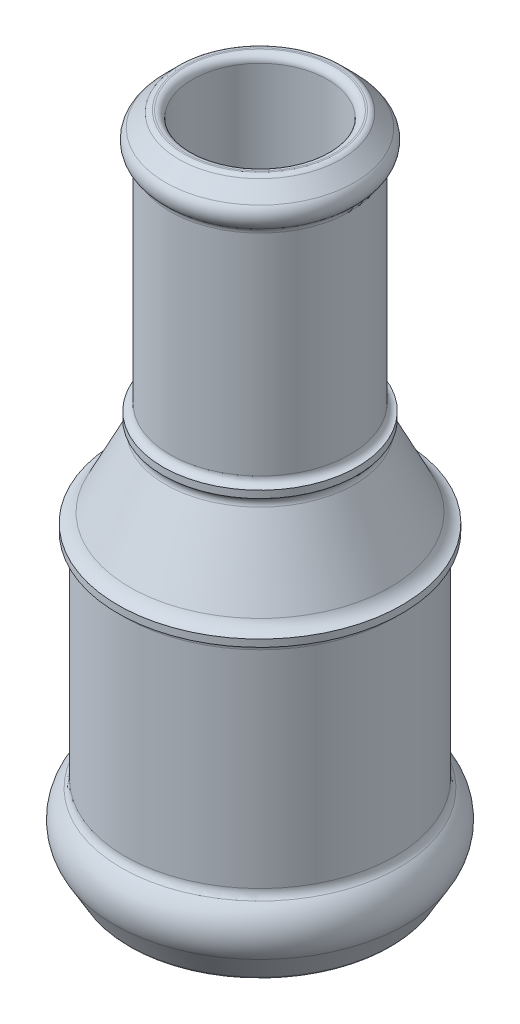
ISO-10303-21;
HEADER;
FILE_DESCRIPTION(('STEP AP214'),'2;1');
FILE_NAME('part.step','',(''),(''),'','','');
FILE_SCHEMA(('AUTOMOTIVE_DESIGN { 1 0 10303 214 1 1 1 1 }'));
ENDSEC;
DATA;
#1=APPLICATION_CONTEXT('core data for automotive mechanical design processes');
#2=APPLICATION_PROTOCOL_DEFINITION('international standard','automotive_design',2000,#1);
#3=PRODUCT_CONTEXT('',#1,'mechanical');
#4=PRODUCT('Part','Part','',(#3));
#5=PRODUCT_RELATED_PRODUCT_CATEGORY('part','',(#4));
#6=PRODUCT_DEFINITION_FORMATION('','',#4);
#7=PRODUCT_DEFINITION_CONTEXT('part definition',#1,'design');
#8=PRODUCT_DEFINITION('design','',#6,#7);
#9=PRODUCT_DEFINITION_SHAPE('','',#8);
#10=(LENGTH_UNIT() NAMED_UNIT(*) SI_UNIT(.MILLI.,.METRE.));
#11=(NAMED_UNIT(*) PLANE_ANGLE_UNIT() SI_UNIT($,.RADIAN.));
#12=(NAMED_UNIT(*) SI_UNIT($,.STERADIAN.) SOLID_ANGLE_UNIT());
#13=UNCERTAINTY_MEASURE_WITH_UNIT(LENGTH_MEASURE(1.E-05),#10,'distance_accuracy_value','');
#14=(GEOMETRIC_REPRESENTATION_CONTEXT(3) GLOBAL_UNCERTAINTY_ASSIGNED_CONTEXT((#13)) GLOBAL_UNIT_ASSIGNED_CONTEXT((#10,
#11,#12)) REPRESENTATION_CONTEXT('',''));
#15=CARTESIAN_POINT('',(0.,0.,0.));
#16=DIRECTION('',(0.,0.,1.));
#17=DIRECTION('',(1.,0.,0.));
#18=AXIS2_PLACEMENT_3D('',#15,#16,#17);
#19=CARTESIAN_POINT('',(0.,0.,0.));
#20=DIRECTION('',(0.,-1.,0.));
#21=DIRECTION('',(0.,0.,-1.));
#22=AXIS2_PLACEMENT_3D('',#19,#20,#21);
#23=CYLINDRICAL_SURFACE('',#22,6.858);
#24=CARTESIAN_POINT('',(0.,28.321,0.));
#25=DIRECTION('',(0.,-1.,0.));
#26=DIRECTION('',(0.,0.,-1.));
#27=AXIS2_PLACEMENT_3D('',#24,#25,#26);
#28=CIRCLE('',#27,6.858);
#29=CARTESIAN_POINT('',(0.,28.321,-6.858));
#30=VERTEX_POINT('',#29);
#31=EDGE_CURVE('E118',#30,#30,#28,.T.);
#32=ORIENTED_EDGE('',*,*,#31,.T.);
#33=EDGE_LOOP('',(#32));
#34=FACE_BOUND('',#33,.T.);
#35=CARTESIAN_POINT('',(0.,27.813,0.));
#36=DIRECTION('',(0.,-1.,0.));
#37=DIRECTION('',(0.,0.,-1.));
#38=AXIS2_PLACEMENT_3D('',#35,#36,#37);
#39=CIRCLE('',#38,6.858);
#40=CARTESIAN_POINT('',(0.,27.813,-6.858));
#41=VERTEX_POINT('',#40);
#42=EDGE_CURVE('E121',#41,#41,#39,.T.);
#43=ORIENTED_EDGE('',*,*,#42,.F.);
#44=EDGE_LOOP('',(#43));
#45=FACE_BOUND('',#44,.T.);
#46=ADVANCED_FACE('F44',(#34,#45),#23,.T.);
#47=CARTESIAN_POINT('',(0.,21.463,0.));
#48=DIRECTION('',(0.,-1.,0.));
#49=DIRECTION('',(0.,0.,-1.));
#50=AXIS2_PLACEMENT_3D('',#47,#48,#49);
#51=CONICAL_SURFACE('',#50,9.525,0.463647609000806);
#52=CARTESIAN_POINT('',(0.,22.130499072282,0.));
#53=DIRECTION('',(0.,-1.,0.));
#54=DIRECTION('',(0.,0.,-1.));
#55=AXIS2_PLACEMENT_3D('',#52,#53,#54);
#56=CIRCLE('',#55,9.19125046385899);
#57=CARTESIAN_POINT('',(0.,22.130499072282,-9.19125046385899));
#58=VERTEX_POINT('',#57);
#59=EDGE_CURVE('E76',#58,#58,#56,.F.);
#60=ORIENTED_EDGE('',*,*,#59,.T.);
#61=EDGE_LOOP('',(#60));
#62=FACE_BOUND('',#61,.T.);
#63=CARTESIAN_POINT('',(0.,27.1579701937796,0.));
#64=DIRECTION('',(0.,-1.,0.));
#65=DIRECTION('',(0.,0.,-1.));
#66=AXIS2_PLACEMENT_3D('',#63,#64,#65);
#67=CIRCLE('',#66,6.67751490311019);
#68=CARTESIAN_POINT('',(0.,27.1579701937796,-6.67751490311019));
#69=VERTEX_POINT('',#68);
#70=EDGE_CURVE('E85',#69,#69,#67,.T.);
#71=ORIENTED_EDGE('',*,*,#70,.T.);
#72=EDGE_LOOP('',(#71));
#73=FACE_BOUND('',#72,.T.);
#74=ADVANCED_FACE('F138',(#62,#73),#51,.T.);
#75=CARTESIAN_POINT('',(0.,0.,0.));
#76=DIRECTION('',(0.,-1.,0.));
#77=DIRECTION('',(0.,0.,-1.));
#78=AXIS2_PLACEMENT_3D('',#75,#76,#77);
#79=CYLINDRICAL_SURFACE('',#78,10.033);
#80=CARTESIAN_POINT('',(0.,20.955,0.));
#81=DIRECTION('',(0.,-1.,0.));
#82=DIRECTION('',(0.,0.,-1.));
#83=AXIS2_PLACEMENT_3D('',#80,#81,#82);
#84=CIRCLE('',#83,10.033);
#85=CARTESIAN_POINT('',(0.,20.955,-10.033));
#86=VERTEX_POINT('',#85);
#87=EDGE_CURVE('E127',#86,#86,#84,.T.);
#88=ORIENTED_EDGE('',*,*,#87,.F.);
#89=EDGE_LOOP('',(#88));
#90=FACE_BOUND('',#89,.T.);
#91=CARTESIAN_POINT('',(0.,21.463,0.));
#92=DIRECTION('',(0.,-1.,0.));
#93=DIRECTION('',(0.,0.,-1.));
#94=AXIS2_PLACEMENT_3D('',#91,#92,#93);
#95=CIRCLE('',#94,10.033);
#96=CARTESIAN_POINT('',(0.,21.463,-10.033));
#97=VERTEX_POINT('',#96);
#98=EDGE_CURVE('E124',#97,#97,#95,.T.);
#99=ORIENTED_EDGE('',*,*,#98,.T.);
#100=EDGE_LOOP('',(#99));
#101=FACE_BOUND('',#100,.T.);
#102=ADVANCED_FACE('F134',(#90,#101),#79,.T.);
#103=CARTESIAN_POINT('',(0.,0.,0.));
#104=DIRECTION('',(0.,-1.,0.));
#105=DIRECTION('',(0.,0.,-1.));
#106=AXIS2_PLACEMENT_3D('',#103,#104,#105);
#107=CYLINDRICAL_SURFACE('',#106,9.525);
#108=CARTESIAN_POINT('',(0.,20.447,0.));
#109=DIRECTION('',(0.,1.,0.));
#110=DIRECTION('',(0.,0.,1.));
#111=AXIS2_PLACEMENT_3D('',#108,#109,#110);
#112=CIRCLE('',#111,9.525);
#113=CARTESIAN_POINT('',(0.,20.447,9.525));
#114=VERTEX_POINT('',#113);
#115=EDGE_CURVE('E79',#114,#114,#112,.F.);
#116=ORIENTED_EDGE('',*,*,#115,.T.);
#117=EDGE_LOOP('',(#116));
#118=FACE_BOUND('',#117,.T.);
#119=CARTESIAN_POINT('',(0.,5.842,0.));
#120=DIRECTION('',(0.,-1.,0.));
#121=DIRECTION('',(0.,0.,-1.));
#122=AXIS2_PLACEMENT_3D('',#119,#120,#121);
#123=CIRCLE('',#122,9.525);
#124=CARTESIAN_POINT('',(0.,5.842,-9.525));
#125=VERTEX_POINT('',#124);
#126=EDGE_CURVE('E103',#125,#125,#123,.F.);
#127=ORIENTED_EDGE('',*,*,#126,.T.);
#128=EDGE_LOOP('',(#127));
#129=FACE_BOUND('',#128,.T.);
#130=ADVANCED_FACE('F137',(#118,#129),#107,.T.);
#131=CARTESIAN_POINT('',(0.,0.,0.));
#132=DIRECTION('',(0.,1.,0.));
#133=DIRECTION('',(0.,0.,1.));
#134=AXIS2_PLACEMENT_3D('',#131,#132,#133);
#135=PLANE('',#134);
#136=CARTESIAN_POINT('',(0.,0.,0.));
#137=DIRECTION('',(0.,1.,0.));
#138=DIRECTION('',(0.,0.,1.));
#139=AXIS2_PLACEMENT_3D('',#136,#137,#138);
#140=CIRCLE('',#139,8.83876669576836);
#141=CARTESIAN_POINT('',(0.,0.,8.83876669576836));
#142=VERTEX_POINT('',#141);
#143=EDGE_CURVE('E70',#142,#142,#140,.F.);
#144=ORIENTED_EDGE('',*,*,#143,.T.);
#145=EDGE_LOOP('',(#144));
#146=FACE_BOUND('',#145,.T.);
#147=CARTESIAN_POINT('',(0.,0.,0.));
#148=DIRECTION('',(0.,1.,0.));
#149=DIRECTION('',(0.,0.,1.));
#150=AXIS2_PLACEMENT_3D('',#147,#148,#149);
#151=CIRCLE('',#150,8.4455);
#152=CARTESIAN_POINT('',(0.,0.,8.4455));
#153=VERTEX_POINT('',#152);
#154=EDGE_CURVE('E73',#153,#153,#151,.T.);
#155=ORIENTED_EDGE('',*,*,#154,.T.);
#156=EDGE_LOOP('',(#155));
#157=FACE_BOUND('',#156,.T.);
#158=ADVANCED_FACE('F239',(#146,#157),#135,.F.);
#159=CARTESIAN_POINT('',(0.,0.,0.));
#160=DIRECTION('',(0.,-1.,0.));
#161=DIRECTION('',(0.,0.,-1.));
#162=AXIS2_PLACEMENT_3D('',#159,#160,#161);
#163=CYLINDRICAL_SURFACE('',#162,7.9375);
#164=CARTESIAN_POINT('',(0.,0.507999999999999,0.));
#165=DIRECTION('',(0.,1.,0.));
#166=DIRECTION('',(0.,0.,1.));
#167=AXIS2_PLACEMENT_3D('',#164,#165,#166);
#168=CIRCLE('',#167,7.9375);
#169=CARTESIAN_POINT('',(0.,0.507999999999999,7.9375));
#170=VERTEX_POINT('',#169);
#171=EDGE_CURVE('E64',#170,#170,#168,.F.);
#172=ORIENTED_EDGE('',*,*,#171,.T.);
#173=EDGE_LOOP('',(#172));
#174=FACE_BOUND('',#173,.T.);
#175=CARTESIAN_POINT('',(0.,20.2637746743011,0.));
#176=DIRECTION('',(0.,-1.,0.));
#177=DIRECTION('',(0.,0.,-1.));
#178=AXIS2_PLACEMENT_3D('',#175,#176,#177);
#179=CIRCLE('',#178,7.9375);
#180=CARTESIAN_POINT('',(0.,20.2637746743011,-7.9375));
#181=VERTEX_POINT('',#180);
#182=EDGE_CURVE('E109',#181,#181,#179,.F.);
#183=ORIENTED_EDGE('',*,*,#182,.T.);
#184=EDGE_LOOP('',(#183));
#185=FACE_BOUND('',#184,.T.);
#186=ADVANCED_FACE('F235',(#174,#185),#163,.F.);
#187=CARTESIAN_POINT('',(0.,21.463,0.));
#188=DIRECTION('',(0.,-1.,0.));
#189=DIRECTION('',(0.,0.,-1.));
#190=AXIS2_PLACEMENT_3D('',#187,#188,#189);
#191=CONICAL_SURFACE('',#190,7.9375,0.463647609000806);
#192=CARTESIAN_POINT('',(0.,22.5356197394408,0.));
#193=DIRECTION('',(0.,-1.,0.));
#194=DIRECTION('',(0.,0.,-1.));
#195=AXIS2_PLACEMENT_3D('',#192,#193,#194);
#196=CIRCLE('',#195,7.40119013027957);
#197=CARTESIAN_POINT('',(0.,22.5356197394408,-7.40119013027957));
#198=VERTEX_POINT('',#197);
#199=EDGE_CURVE('E112',#198,#198,#196,.T.);
#200=ORIENTED_EDGE('',*,*,#199,.T.);
#201=EDGE_LOOP('',(#200));
#202=FACE_BOUND('',#201,.T.);
#203=CARTESIAN_POINT('',(0.,26.7403802605591,0.));
#204=DIRECTION('',(0.,1.,0.));
#205=DIRECTION('',(0.,0.,1.));
#206=AXIS2_PLACEMENT_3D('',#203,#204,#205);
#207=CIRCLE('',#206,5.29880986972043);
#208=CARTESIAN_POINT('',(0.,26.7403802605591,5.29880986972043));
#209=VERTEX_POINT('',#208);
#210=EDGE_CURVE('E115',#209,#209,#207,.T.);
#211=ORIENTED_EDGE('',*,*,#210,.T.);
#212=EDGE_LOOP('',(#211));
#213=FACE_BOUND('',#212,.T.);
#214=ADVANCED_FACE('F232',(#202,#213),#191,.F.);
#215=CARTESIAN_POINT('',(0.,0.,0.));
#216=DIRECTION('',(0.,-1.,0.));
#217=DIRECTION('',(0.,0.,-1.));
#218=AXIS2_PLACEMENT_3D('',#215,#216,#217);
#219=CYLINDRICAL_SURFACE('',#218,4.7625);
#220=CARTESIAN_POINT('',(0.,46.228,0.));
#221=DIRECTION('',(0.,1.,0.));
#222=DIRECTION('',(0.,0.,1.));
#223=AXIS2_PLACEMENT_3D('',#220,#221,#222);
#224=CIRCLE('',#223,4.7625);
#225=CARTESIAN_POINT('',(0.,46.228,4.7625));
#226=VERTEX_POINT('',#225);
#227=EDGE_CURVE('E10',#226,#226,#224,.T.);
#228=ORIENTED_EDGE('',*,*,#227,.T.);
#229=EDGE_LOOP('',(#228));
#230=FACE_BOUND('',#229,.T.);
#231=CARTESIAN_POINT('',(0.,29.0122253256989,0.));
#232=DIRECTION('',(0.,1.,0.));
#233=DIRECTION('',(0.,0.,1.));
#234=AXIS2_PLACEMENT_3D('',#231,#232,#233);
#235=CIRCLE('',#234,4.7625);
#236=CARTESIAN_POINT('',(0.,29.0122253256989,4.7625));
#237=VERTEX_POINT('',#236);
#238=EDGE_CURVE('E106',#237,#237,#235,.F.);
#239=ORIENTED_EDGE('',*,*,#238,.T.);
#240=EDGE_LOOP('',(#239));
#241=FACE_BOUND('',#240,.T.);
#242=ADVANCED_FACE('F226',(#230,#241),#219,.F.);
#243=CARTESIAN_POINT('',(0.,46.736,0.));
#244=DIRECTION('',(0.,1.,0.));
#245=DIRECTION('',(0.,0.,1.));
#246=AXIS2_PLACEMENT_3D('',#243,#244,#245);
#247=PLANE('',#246);
#248=CARTESIAN_POINT('',(0.,46.736,0.));
#249=DIRECTION('',(0.,1.,0.));
#250=DIRECTION('',(0.,0.,1.));
#251=AXIS2_PLACEMENT_3D('',#248,#249,#250);
#252=CIRCLE('',#251,5.37757951031445);
#253=CARTESIAN_POINT('',(0.,46.736,5.37757951031445));
#254=VERTEX_POINT('',#253);
#255=EDGE_CURVE('E55',#254,#254,#252,.T.);
#256=ORIENTED_EDGE('',*,*,#255,.T.);
#257=EDGE_LOOP('',(#256));
#258=FACE_BOUND('',#257,.T.);
#259=CARTESIAN_POINT('',(0.,46.736,0.));
#260=DIRECTION('',(0.,1.,0.));
#261=DIRECTION('',(0.,0.,1.));
#262=AXIS2_PLACEMENT_3D('',#259,#260,#261);
#263=CIRCLE('',#262,5.2705);
#264=CARTESIAN_POINT('',(0.,46.736,5.2705));
#265=VERTEX_POINT('',#264);
#266=EDGE_CURVE('E59',#265,#265,#263,.F.);
#267=ORIENTED_EDGE('',*,*,#266,.T.);
#268=EDGE_LOOP('',(#267));
#269=FACE_BOUND('',#268,.T.);
#270=ADVANCED_FACE('F219',(#258,#269),#247,.T.);
#271=CARTESIAN_POINT('',(0.,0.,0.));
#272=DIRECTION('',(0.,-1.,0.));
#273=DIRECTION('',(0.,0.,-1.));
#274=AXIS2_PLACEMENT_3D('',#271,#272,#273);
#275=CYLINDRICAL_SURFACE('',#274,6.35);
#276=CARTESIAN_POINT('',(0.,28.829,0.));
#277=DIRECTION('',(0.,1.,0.));
#278=DIRECTION('',(0.,0.,1.));
#279=AXIS2_PLACEMENT_3D('',#276,#277,#278);
#280=CIRCLE('',#279,6.35);
#281=CARTESIAN_POINT('',(0.,28.829,6.35));
#282=VERTEX_POINT('',#281);
#283=EDGE_CURVE('E82',#282,#282,#280,.T.);
#284=ORIENTED_EDGE('',*,*,#283,.T.);
#285=EDGE_LOOP('',(#284));
#286=FACE_BOUND('',#285,.T.);
#287=CARTESIAN_POINT('',(0.,43.688,0.));
#288=DIRECTION('',(0.,-1.,0.));
#289=DIRECTION('',(0.,0.,-1.));
#290=AXIS2_PLACEMENT_3D('',#287,#288,#289);
#291=CIRCLE('',#290,6.35);
#292=CARTESIAN_POINT('',(0.,43.688,-6.35));
#293=VERTEX_POINT('',#292);
#294=EDGE_CURVE('E94',#293,#293,#291,.T.);
#295=ORIENTED_EDGE('',*,*,#294,.T.);
#296=EDGE_LOOP('',(#295));
#297=FACE_BOUND('',#296,.T.);
#298=ADVANCED_FACE('F171',(#286,#297),#275,.T.);
#299=CARTESIAN_POINT('',(0.,20.2637746743011,0.));
#300=DIRECTION('',(0.,-1.,0.));
#301=DIRECTION('',(0.,0.,-1.));
#302=AXIS2_PLACEMENT_3D('',#299,#300,#301);
#303=DEGENERATE_TOROIDAL_SURFACE('',#302,2.8575,5.08,.T.);
#304=ORIENTED_EDGE('',*,*,#182,.F.);
#305=EDGE_LOOP('',(#304));
#306=FACE_BOUND('',#305,.T.);
#307=ORIENTED_EDGE('',*,*,#199,.F.);
#308=EDGE_LOOP('',(#307));
#309=FACE_BOUND('',#308,.T.);
#310=ADVANCED_FACE('F167',(#306,#309),#303,.F.);
#311=CARTESIAN_POINT('',(0.,29.0122253256989,0.));
#312=DIRECTION('',(0.,1.,0.));
#313=DIRECTION('',(0.,0.,1.));
#314=AXIS2_PLACEMENT_3D('',#311,#312,#313);
#315=TOROIDAL_SURFACE('',#314,9.8425,5.08);
#316=ORIENTED_EDGE('',*,*,#210,.F.);
#317=EDGE_LOOP('',(#316));
#318=FACE_BOUND('',#317,.T.);
#319=ORIENTED_EDGE('',*,*,#238,.F.);
#320=EDGE_LOOP('',(#319));
#321=FACE_BOUND('',#320,.T.);
#322=ADVANCED_FACE('F170',(#318,#321),#315,.T.);
#323=CARTESIAN_POINT('',(0.,0.,0.));
#324=DIRECTION('',(0.,1.,0.));
#325=DIRECTION('',(0.,0.,1.));
#326=AXIS2_PLACEMENT_3D('',#323,#324,#325);
#327=CONICAL_SURFACE('',#326,9.13206063251669,0.523598775598296);
#328=CARTESIAN_POINT('',(0.,0.254,0.));
#329=DIRECTION('',(0.,1.,0.));
#330=DIRECTION('',(0.,0.,1.));
#331=AXIS2_PLACEMENT_3D('',#328,#329,#330);
#332=CIRCLE('',#331,9.27870760089085);
#333=CARTESIAN_POINT('',(0.,0.254,9.27870760089085));
#334=VERTEX_POINT('',#333);
#335=EDGE_CURVE('E67',#334,#334,#332,.T.);
#336=CARTESIAN_POINT('',(0.,2.07271748486344,0.));
#337=DIRECTION('',(0.,1.,0.));
#338=DIRECTION('',(0.,0.,1.));
#339=AXIS2_PLACEMENT_3D('',#336,#337,#338);
#340=CIRCLE('',#339,10.3287446303566);
#341=CARTESIAN_POINT('',(0.,2.07271748486344,10.3287446303566));
#342=VERTEX_POINT('',#341);
#343=EDGE_CURVE('E100',#342,#342,#340,.F.);
#344=CARTESIAN_POINT('',(0.,0.254,9.27870760089085));
#345=CARTESIAN_POINT('',(0.,0.272944973800661,9.28964548661445));
#346=CARTESIAN_POINT('',(0.,0.291889947601322,9.30058337233806));
#347=CARTESIAN_POINT('',(0.,0.329779895202643,9.32245914378526));
#348=CARTESIAN_POINT('',(0.,0.348724869003304,9.33339702950886));
#349=CARTESIAN_POINT('',(0.,0.386614816604625,9.35527280095607));
#350=CARTESIAN_POINT('',(0.,0.405559790405286,9.36621068667967));
#351=CARTESIAN_POINT('',(0.,0.443449738006608,9.38808645812687));
#352=CARTESIAN_POINT('',(0.,0.462394711807269,9.39902434385047));
#353=CARTESIAN_POINT('',(0.,0.50028465940859,9.42090011529768));
#354=CARTESIAN_POINT('',(0.,0.519229633209251,9.43183800102128));
#355=CARTESIAN_POINT('',(0.,0.557119580810573,9.45371377246848));
#356=CARTESIAN_POINT('',(0.,0.576064554611234,9.46465165819209));
#357=CARTESIAN_POINT('',(0.,0.613954502212555,9.48652742963929));
#358=CARTESIAN_POINT('',(0.,0.632899476013216,9.49746531536289));
#359=CARTESIAN_POINT('',(0.,0.670789423614537,9.51934108681009));
#360=CARTESIAN_POINT('',(0.,0.689734397415198,9.5302789725337));
#361=CARTESIAN_POINT('',(0.,0.72762434501652,9.5521547439809));
#362=CARTESIAN_POINT('',(0.,0.746569318817181,9.5630926297045));
#363=CARTESIAN_POINT('',(0.,0.784459266418502,9.58496840115171));
#364=CARTESIAN_POINT('',(0.,0.803404240219163,9.59590628687531));
#365=CARTESIAN_POINT('',(0.,0.841294187820485,9.61778205832251));
#366=CARTESIAN_POINT('',(0.,0.860239161621146,9.62871994404611));
#367=CARTESIAN_POINT('',(0.,0.898129109222467,9.65059571549332));
#368=CARTESIAN_POINT('',(0.,0.917074083023128,9.66153360121692));
#369=CARTESIAN_POINT('',(0.,0.95496403062445,9.68340937266412));
#370=CARTESIAN_POINT('',(0.,0.973909004425111,9.69434725838773));
#371=CARTESIAN_POINT('',(0.,1.01179895202643,9.71622302983493));
#372=CARTESIAN_POINT('',(0.,1.03074392582709,9.72716091555853));
#373=CARTESIAN_POINT('',(0.,1.06863387342841,9.74903668700573));
#374=CARTESIAN_POINT('',(0.,1.08757884722908,9.75997457272934));
#375=CARTESIAN_POINT('',(0.,1.1254687948304,9.78185034417654));
#376=CARTESIAN_POINT('',(0.,1.14441376863106,9.79278822990014));
#377=CARTESIAN_POINT('',(0.,1.18230371623238,9.81466400134734));
#378=CARTESIAN_POINT('',(0.,1.20124869003304,9.82560188707095));
#379=CARTESIAN_POINT('',(0.,1.23913863763436,9.84747765851815));
#380=CARTESIAN_POINT('',(0.,1.25808361143502,9.85841554424175));
#381=CARTESIAN_POINT('',(0.,1.29597355903634,9.88029131568896));
#382=CARTESIAN_POINT('',(0.,1.31491853283701,9.89122920141256));
#383=CARTESIAN_POINT('',(0.,1.35280848043833,9.91310497285976));
#384=CARTESIAN_POINT('',(0.,1.37175345423899,9.92404285858336));
#385=CARTESIAN_POINT('',(0.,1.40964340184031,9.94591863003057));
#386=CARTESIAN_POINT('',(0.,1.42858837564097,9.95685651575417));
#387=CARTESIAN_POINT('',(0.,1.46647832324229,9.97873228720137));
#388=CARTESIAN_POINT('',(0.,1.48542329704295,9.98967017292498));
#389=CARTESIAN_POINT('',(0.,1.52331324464427,10.0115459443722));
#390=CARTESIAN_POINT('',(0.,1.54225821844493,10.0224838300958));
#391=CARTESIAN_POINT('',(0.,1.58014816604626,10.044359601543));
#392=CARTESIAN_POINT('',(0.,1.59909313984692,10.0552974872666));
#393=CARTESIAN_POINT('',(0.,1.63698308744824,10.0771732587138));
#394=CARTESIAN_POINT('',(0.,1.6559280612489,10.0881111444374));
#395=CARTESIAN_POINT('',(0.,1.69381800885022,10.1099869158846));
#396=CARTESIAN_POINT('',(0.,1.71276298265088,10.1209248016082));
#397=CARTESIAN_POINT('',(0.,1.7506529302522,10.1428005730554));
#398=CARTESIAN_POINT('',(0.,1.76959790405286,10.153738458779));
#399=CARTESIAN_POINT('',(0.,1.80748785165419,10.1756142302262));
#400=CARTESIAN_POINT('',(0.,1.82643282545485,10.1865521159498));
#401=CARTESIAN_POINT('',(0.,1.86432277305617,10.208427887397));
#402=CARTESIAN_POINT('',(0.,1.88326774685683,10.2193657731206));
#403=CARTESIAN_POINT('',(0.,1.92115769445815,10.2412415445678));
#404=CARTESIAN_POINT('',(0.,1.94010266825881,10.2521794302914));
#405=CARTESIAN_POINT('',(0.,1.97799261586013,10.2740552017386));
#406=CARTESIAN_POINT('',(0.,1.99693758966079,10.2849930874622));
#407=CARTESIAN_POINT('',(0.,2.03482753726212,10.3068688589094));
#408=CARTESIAN_POINT('',(0.,2.05377251106278,10.317806744633));
#409=CARTESIAN_POINT('',(0.,2.07271748486344,10.3287446303566));
#410=B_SPLINE_CURVE_WITH_KNOTS('',3,(#344,#345,#346,#347,#348,#349,#350,#351,#352,#353,#354,
#355,#356,#357,#358,#359,#360,#361,#362,#363,#364,#365,#366,#367,#368,#369,#370,#371,#372,#373,
#374,#375,#376,#377,#378,#379,#380,#381,#382,#383,#384,#385,#386,#387,#388,#389,#390,#391,#392,
#393,#394,#395,#396,#397,#398,#399,#400,#401,#402,#403,#404,#405,#406,#407,#408,#409),
.UNSPECIFIED.,.F.,.F.,(4,2,2,2,2,2,2,2,2,2,2,2,2,2,2,2,2,2,2,2,2,2,2,2,2,2,2,2,2,2,2,2,4),(0.,
0.0656273143416113,0.131254628683223,0.196881943024835,0.262509257366446,0.328136571708057,
0.393763886049668,0.459391200391281,0.525018514732892,0.590645829074503,0.656273143416114,
0.721900457757726,0.787527772099338,0.853155086440949,0.91878240078256,0.984409715124172,
1.05003702946578,1.11566434380739,1.18129165814901,1.24691897249062,1.31254628683223,
1.37817360117384,1.44380091551545,1.50942822985706,1.57505554419867,1.64068285854029,
1.7063101728819,1.77193748722351,1.83756480156512,1.90319211590673,1.96881943024834,
2.03444674458996,2.10007405893157),.UNSPECIFIED.);
#411=EDGE_CURVE('BSEAM175',#334,#342,#410,.T.);
#412=ORIENTED_EDGE('',*,*,#335,.T.);
#413=ORIENTED_EDGE('',*,*,#343,.T.);
#414=ORIENTED_EDGE('',*,*,#411,.T.);
#415=ORIENTED_EDGE('',*,*,#411,.F.);
#416=EDGE_LOOP('',(#412,#414,#413,#415));
#417=FACE_BOUND('',#416,.T.);
#418=ADVANCED_FACE('F175',(#417),#327,.T.);
#419=CARTESIAN_POINT('',(0.,5.842,0.));
#420=DIRECTION('',(0.,-1.,0.));
#421=DIRECTION('',(0.,0.,-1.));
#422=AXIS2_PLACEMENT_3D('',#419,#420,#421);
#423=TOROIDAL_SURFACE('',#422,10.287,0.762);
#424=CARTESIAN_POINT('',(0.,5.26524249650693,0.));
#425=DIRECTION('',(0.,1.,0.));
#426=DIRECTION('',(0.,0.,1.));
#427=AXIS2_PLACEMENT_3D('',#424,#425,#426);
#428=CIRCLE('',#427,9.78900925494094);
#429=CARTESIAN_POINT('',(0.,5.26524249650693,9.78900925494094));
#430=VERTEX_POINT('',#429);
#431=EDGE_CURVE('E97',#430,#430,#428,.T.);
#432=ORIENTED_EDGE('',*,*,#431,.T.);
#433=EDGE_LOOP('',(#432));
#434=FACE_BOUND('',#433,.T.);
#435=ORIENTED_EDGE('',*,*,#126,.F.);
#436=EDGE_LOOP('',(#435));
#437=FACE_BOUND('',#436,.T.);
#438=ADVANCED_FACE('F183',(#434,#437),#423,.F.);
#439=CARTESIAN_POINT('',(0.,3.34271748486343,0.));
#440=DIRECTION('',(0.,1.,0.));
#441=DIRECTION('',(0.,0.,1.));
#442=AXIS2_PLACEMENT_3D('',#439,#440,#441);
#443=TOROIDAL_SURFACE('',#442,8.12904010474415,2.54);
#444=ORIENTED_EDGE('',*,*,#431,.F.);
#445=EDGE_LOOP('',(#444));
#446=FACE_BOUND('',#445,.T.);
#447=ORIENTED_EDGE('',*,*,#343,.F.);
#448=EDGE_LOOP('',(#447));
#449=FACE_BOUND('',#448,.T.);
#450=ADVANCED_FACE('F187',(#446,#449),#443,.T.);
#451=CARTESIAN_POINT('',(0.,44.196,0.));
#452=DIRECTION('',(0.,-1.,0.));
#453=DIRECTION('',(0.,0.,-1.));
#454=AXIS2_PLACEMENT_3D('',#451,#452,#453);
#455=CONICAL_SURFACE('',#454,8.128,0.785398163397449);
#456=CARTESIAN_POINT('',(0.,46.5872102448428,0.));
#457=DIRECTION('',(0.,1.,0.));
#458=DIRECTION('',(0.,0.,1.));
#459=AXIS2_PLACEMENT_3D('',#456,#457,#458);
#460=CIRCLE('',#459,5.73678975515722);
#461=CARTESIAN_POINT('',(0.,46.5872102448428,5.73678975515722));
#462=VERTEX_POINT('',#461);
#463=EDGE_CURVE('E51',#462,#462,#460,.F.);
#464=ORIENTED_EDGE('',*,*,#463,.T.);
#465=EDGE_LOOP('',(#464));
#466=FACE_BOUND('',#465,.T.);
#467=CARTESIAN_POINT('',(0.,45.6410444683663,0.));
#468=DIRECTION('',(0.,-1.,0.));
#469=DIRECTION('',(0.,0.,-1.));
#470=AXIS2_PLACEMENT_3D('',#467,#468,#469);
#471=CIRCLE('',#470,6.68295553163372);
#472=CARTESIAN_POINT('',(0.,45.6410444683663,-6.68295553163372));
#473=VERTEX_POINT('',#472);
#474=EDGE_CURVE('E88',#473,#473,#471,.F.);
#475=ORIENTED_EDGE('',*,*,#474,.T.);
#476=EDGE_LOOP('',(#475));
#477=FACE_BOUND('',#476,.T.);
#478=ADVANCED_FACE('F191',(#466,#477),#455,.T.);
#479=CARTESIAN_POINT('',(0.,43.688,0.));
#480=DIRECTION('',(0.,-1.,0.));
#481=DIRECTION('',(0.,0.,-1.));
#482=AXIS2_PLACEMENT_3D('',#479,#480,#481);
#483=TOROIDAL_SURFACE('',#482,6.858,0.508);
#484=CARTESIAN_POINT('',(0.,44.0995413262269,0.));
#485=DIRECTION('',(0.,-1.,0.));
#486=DIRECTION('',(0.,0.,-1.));
#487=AXIS2_PLACEMENT_3D('',#484,#485,#486);
#488=CIRCLE('',#487,6.56017834731605);
#489=CARTESIAN_POINT('',(0.,44.0995413262269,-6.56017834731605));
#490=VERTEX_POINT('',#489);
#491=EDGE_CURVE('E91',#490,#490,#488,.T.);
#492=ORIENTED_EDGE('',*,*,#491,.T.);
#493=EDGE_LOOP('',(#492));
#494=FACE_BOUND('',#493,.T.);
#495=ORIENTED_EDGE('',*,*,#294,.F.);
#496=EDGE_LOOP('',(#495));
#497=FACE_BOUND('',#496,.T.);
#498=ADVANCED_FACE('F197',(#494,#497),#483,.F.);
#499=CARTESIAN_POINT('',(0.,44.9226239786807,0.));
#500=DIRECTION('',(0.,1.,0.));
#501=DIRECTION('',(0.,0.,1.));
#502=AXIS2_PLACEMENT_3D('',#499,#500,#501);
#503=TOROIDAL_SURFACE('',#502,5.96453504194819,1.016);
#504=ORIENTED_EDGE('',*,*,#474,.F.);
#505=EDGE_LOOP('',(#504));
#506=FACE_BOUND('',#505,.T.);
#507=ORIENTED_EDGE('',*,*,#491,.F.);
#508=EDGE_LOOP('',(#507));
#509=FACE_BOUND('',#508,.T.);
#510=ADVANCED_FACE('F200',(#506,#509),#503,.T.);
#511=CARTESIAN_POINT('',(0.,27.3851547002936,0.));
#512=DIRECTION('',(0.,1.,0.));
#513=DIRECTION('',(0.,0.,1.));
#514=AXIS2_PLACEMENT_3D('',#511,#512,#513);
#515=TOROIDAL_SURFACE('',#514,7.13188391613814,0.508);
#516=ORIENTED_EDGE('',*,*,#42,.T.);
#517=EDGE_LOOP('',(#516));
#518=FACE_BOUND('',#517,.T.);
#519=ORIENTED_EDGE('',*,*,#70,.F.);
#520=EDGE_LOOP('',(#519));
#521=FACE_BOUND('',#520,.T.);
#522=ADVANCED_FACE('F204',(#518,#521),#515,.F.);
#523=CARTESIAN_POINT('',(0.,28.829,0.));
#524=DIRECTION('',(0.,1.,0.));
#525=DIRECTION('',(0.,0.,1.));
#526=AXIS2_PLACEMENT_3D('',#523,#524,#525);
#527=TOROIDAL_SURFACE('',#526,6.858,0.508);
#528=ORIENTED_EDGE('',*,*,#283,.F.);
#529=EDGE_LOOP('',(#528));
#530=FACE_BOUND('',#529,.T.);
#531=ORIENTED_EDGE('',*,*,#31,.F.);
#532=EDGE_LOOP('',(#531));
#533=FACE_BOUND('',#532,.T.);
#534=ADVANCED_FACE('F154',(#530,#533),#527,.F.);
#535=CARTESIAN_POINT('',(0.,20.447,0.));
#536=DIRECTION('',(0.,1.,0.));
#537=DIRECTION('',(0.,0.,1.));
#538=AXIS2_PLACEMENT_3D('',#535,#536,#537);
#539=TOROIDAL_SURFACE('',#538,10.033,0.508);
#540=ORIENTED_EDGE('',*,*,#87,.T.);
#541=EDGE_LOOP('',(#540));
#542=FACE_BOUND('',#541,.T.);
#543=ORIENTED_EDGE('',*,*,#115,.F.);
#544=EDGE_LOOP('',(#543));
#545=FACE_BOUND('',#544,.T.);
#546=ADVANCED_FACE('F131',(#542,#545),#539,.F.);
#547=CARTESIAN_POINT('',(0.,22.698460338567,0.));
#548=DIRECTION('',(0.,-1.,0.));
#549=DIRECTION('',(0.,0.,-1.));
#550=AXIS2_PLACEMENT_3D('',#547,#548,#549);
#551=TOROIDAL_SURFACE('',#550,10.3271729964289,1.27);
#552=ORIENTED_EDGE('',*,*,#59,.F.);
#553=EDGE_LOOP('',(#552));
#554=FACE_BOUND('',#553,.T.);
#555=ORIENTED_EDGE('',*,*,#98,.F.);
#556=EDGE_LOOP('',(#555));
#557=FACE_BOUND('',#556,.T.);
#558=ADVANCED_FACE('F142',(#554,#557),#551,.F.);
#559=CARTESIAN_POINT('',(0.,0.507999999999999,0.));
#560=DIRECTION('',(0.,1.,0.));
#561=DIRECTION('',(0.,0.,1.));
#562=AXIS2_PLACEMENT_3D('',#559,#560,#561);
#563=TOROIDAL_SURFACE('',#562,8.83876669576836,0.508);
#564=ORIENTED_EDGE('',*,*,#335,.F.);
#565=EDGE_LOOP('',(#564));
#566=FACE_BOUND('',#565,.T.);
#567=ORIENTED_EDGE('',*,*,#143,.F.);
#568=EDGE_LOOP('',(#567));
#569=FACE_BOUND('',#568,.T.);
#570=ADVANCED_FACE('F144',(#566,#569),#563,.T.);
#571=CARTESIAN_POINT('',(0.,0.507999999999999,0.));
#572=DIRECTION('',(0.,1.,0.));
#573=DIRECTION('',(0.,0.,1.));
#574=AXIS2_PLACEMENT_3D('',#571,#572,#573);
#575=TOROIDAL_SURFACE('',#574,8.4455,0.508);
#576=ORIENTED_EDGE('',*,*,#154,.F.);
#577=EDGE_LOOP('',(#576));
#578=FACE_BOUND('',#577,.T.);
#579=ORIENTED_EDGE('',*,*,#171,.F.);
#580=EDGE_LOOP('',(#579));
#581=FACE_BOUND('',#580,.T.);
#582=ADVANCED_FACE('F151',(#578,#581),#575,.T.);
#583=CARTESIAN_POINT('',(0.,46.228,0.));
#584=DIRECTION('',(0.,1.,0.));
#585=DIRECTION('',(0.,0.,1.));
#586=AXIS2_PLACEMENT_3D('',#583,#584,#585);
#587=TOROIDAL_SURFACE('',#586,5.37757951031445,0.508);
#588=ORIENTED_EDGE('',*,*,#463,.F.);
#589=EDGE_LOOP('',(#588));
#590=FACE_BOUND('',#589,.T.);
#591=ORIENTED_EDGE('',*,*,#255,.F.);
#592=EDGE_LOOP('',(#591));
#593=FACE_BOUND('',#592,.T.);
#594=ADVANCED_FACE('F293',(#590,#593),#587,.T.);
#595=CARTESIAN_POINT('',(0.,46.228,0.));
#596=DIRECTION('',(0.,1.,0.));
#597=DIRECTION('',(0.,0.,1.));
#598=AXIS2_PLACEMENT_3D('',#595,#596,#597);
#599=TOROIDAL_SURFACE('',#598,5.2705,0.508);
#600=ORIENTED_EDGE('',*,*,#227,.F.);
#601=EDGE_LOOP('',(#600));
#602=FACE_BOUND('',#601,.T.);
#603=ORIENTED_EDGE('',*,*,#266,.F.);
#604=EDGE_LOOP('',(#603));
#605=FACE_BOUND('',#604,.T.);
#606=ADVANCED_FACE('F46',(#602,#605),#599,.T.);
#607=CLOSED_SHELL('',(#46,#74,#102,#130,#158,#186,#214,#242,#270,#298,#310,#322,#418,#438,#450,
#478,#498,#510,#522,#534,#546,#558,#570,#582,#594,#606));
#608=MANIFOLD_SOLID_BREP('B2',#607);
#609=ADVANCED_BREP_SHAPE_REPRESENTATION('',(#18,#608),#14);
#610=SHAPE_DEFINITION_REPRESENTATION(#9,#609);
ENDSEC;
END-ISO-10303-21;
